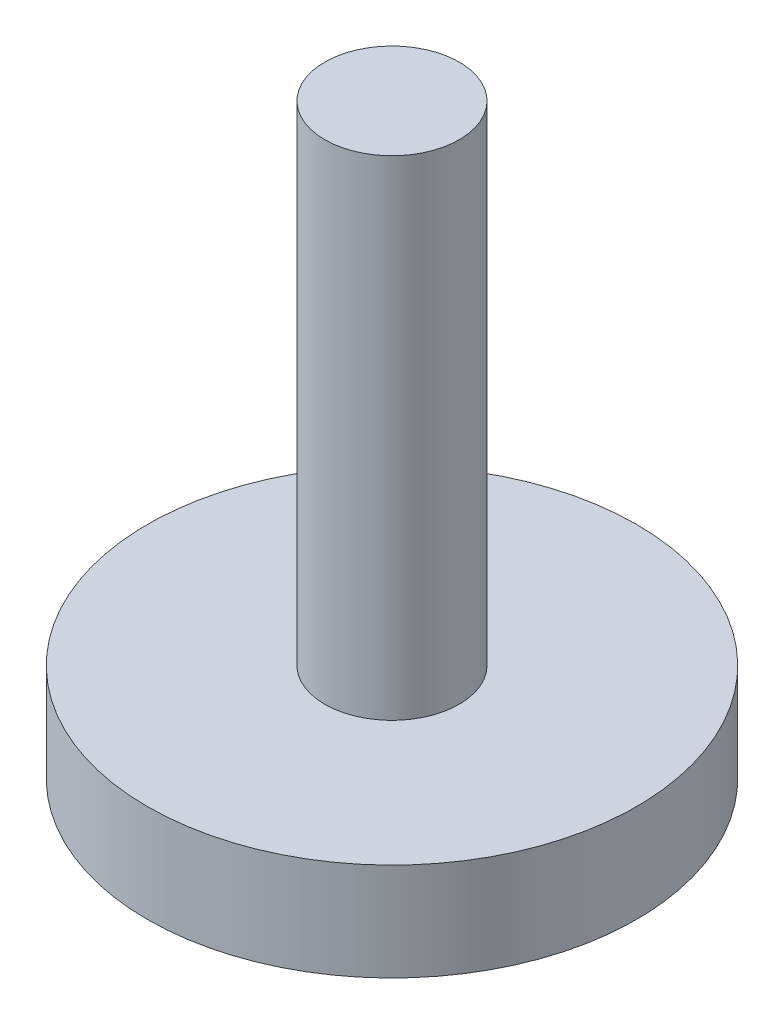
ISO-10303-21;
HEADER;
FILE_DESCRIPTION(('STEP AP214'),'2;1');
FILE_NAME('part.step','',(''),(''),'','','');
FILE_SCHEMA(('AUTOMOTIVE_DESIGN { 1 0 10303 214 1 1 1 1 }'));
ENDSEC;
DATA;
#1=APPLICATION_CONTEXT('core data for automotive mechanical design processes');
#2=APPLICATION_PROTOCOL_DEFINITION('international standard','automotive_design',2000,#1);
#3=PRODUCT_CONTEXT('',#1,'mechanical');
#4=PRODUCT('Part','Part','',(#3));
#5=PRODUCT_RELATED_PRODUCT_CATEGORY('part','',(#4));
#6=PRODUCT_DEFINITION_FORMATION('','',#4);
#7=PRODUCT_DEFINITION_CONTEXT('part definition',#1,'design');
#8=PRODUCT_DEFINITION('design','',#6,#7);
#9=PRODUCT_DEFINITION_SHAPE('','',#8);
#10=(LENGTH_UNIT() NAMED_UNIT(*) SI_UNIT(.MILLI.,.METRE.));
#11=(NAMED_UNIT(*) PLANE_ANGLE_UNIT() SI_UNIT($,.RADIAN.));
#12=(NAMED_UNIT(*) SI_UNIT($,.STERADIAN.) SOLID_ANGLE_UNIT());
#13=UNCERTAINTY_MEASURE_WITH_UNIT(LENGTH_MEASURE(1.E-05),#10,'distance_accuracy_value','');
#14=(GEOMETRIC_REPRESENTATION_CONTEXT(3) GLOBAL_UNCERTAINTY_ASSIGNED_CONTEXT((#13)) GLOBAL_UNIT_ASSIGNED_CONTEXT((#10,
#11,#12)) REPRESENTATION_CONTEXT('',''));
#15=CARTESIAN_POINT('',(0.,0.,0.));
#16=DIRECTION('',(0.,0.,1.));
#17=DIRECTION('',(1.,0.,0.));
#18=AXIS2_PLACEMENT_3D('',#15,#16,#17);
#19=CARTESIAN_POINT('',(0.,3.,0.));
#20=DIRECTION('',(0.,-1.,0.));
#21=DIRECTION('',(0.,0.,-1.));
#22=AXIS2_PLACEMENT_3D('',#19,#20,#21);
#23=CYLINDRICAL_SURFACE('',#22,7.5);
#24=CARTESIAN_POINT('',(0.,3.,0.));
#25=DIRECTION('',(0.,1.,0.));
#26=DIRECTION('',(0.,0.,1.));
#27=AXIS2_PLACEMENT_3D('',#24,#25,#26);
#28=CIRCLE('',#27,7.5);
#29=CARTESIAN_POINT('',(0.,3.,7.5));
#30=VERTEX_POINT('',#29);
#31=EDGE_CURVE('E45',#30,#30,#28,.T.);
#32=ORIENTED_EDGE('',*,*,#31,.F.);
#33=EDGE_LOOP('',(#32));
#34=FACE_BOUND('',#33,.T.);
#35=CARTESIAN_POINT('',(0.,0.,0.));
#36=DIRECTION('',(0.,1.,0.));
#37=DIRECTION('',(0.,0.,1.));
#38=AXIS2_PLACEMENT_3D('',#35,#36,#37);
#39=CIRCLE('',#38,7.5);
#40=CARTESIAN_POINT('',(0.,0.,7.5));
#41=VERTEX_POINT('',#40);
#42=EDGE_CURVE('E40',#41,#41,#39,.T.);
#43=ORIENTED_EDGE('',*,*,#42,.T.);
#44=EDGE_LOOP('',(#43));
#45=FACE_BOUND('',#44,.T.);
#46=ADVANCED_FACE('F37',(#34,#45),#23,.T.);
#47=CARTESIAN_POINT('',(0.,3.,0.));
#48=DIRECTION('',(0.,1.,0.));
#49=DIRECTION('',(0.,0.,1.));
#50=AXIS2_PLACEMENT_3D('',#47,#48,#49);
#51=PLANE('',#50);
#52=CARTESIAN_POINT('',(0.,3.,0.));
#53=DIRECTION('',(0.,1.,0.));
#54=DIRECTION('',(0.,0.,1.));
#55=AXIS2_PLACEMENT_3D('',#52,#53,#54);
#56=CIRCLE('',#55,2.0625);
#57=CARTESIAN_POINT('',(0.,3.,2.0625));
#58=VERTEX_POINT('',#57);
#59=EDGE_CURVE('E10',#58,#58,#56,.T.);
#60=ORIENTED_EDGE('',*,*,#59,.F.);
#61=EDGE_LOOP('',(#60));
#62=FACE_BOUND('',#61,.T.);
#63=ORIENTED_EDGE('',*,*,#31,.T.);
#64=EDGE_LOOP('',(#63));
#65=FACE_BOUND('',#64,.T.);
#66=ADVANCED_FACE('F65',(#62,#65),#51,.T.);
#67=CARTESIAN_POINT('',(0.,0.,0.));
#68=DIRECTION('',(0.,1.,0.));
#69=DIRECTION('',(0.,0.,1.));
#70=AXIS2_PLACEMENT_3D('',#67,#68,#69);
#71=PLANE('',#70);
#72=ORIENTED_EDGE('',*,*,#42,.F.);
#73=EDGE_LOOP('',(#72));
#74=FACE_BOUND('',#73,.T.);
#75=ADVANCED_FACE('F62',(#74),#71,.F.);
#76=CARTESIAN_POINT('',(0.,18.,0.));
#77=DIRECTION('',(0.,-1.,0.));
#78=DIRECTION('',(0.,0.,-1.));
#79=AXIS2_PLACEMENT_3D('',#76,#77,#78);
#80=CYLINDRICAL_SURFACE('',#79,2.0625);
#81=CARTESIAN_POINT('',(0.,18.,0.));
#82=DIRECTION('',(0.,1.,0.));
#83=DIRECTION('',(0.,0.,1.));
#84=AXIS2_PLACEMENT_3D('',#81,#82,#83);
#85=CIRCLE('',#84,2.0625);
#86=CARTESIAN_POINT('',(0.,18.,2.0625));
#87=VERTEX_POINT('',#86);
#88=EDGE_CURVE('E52',#87,#87,#85,.T.);
#89=ORIENTED_EDGE('',*,*,#88,.F.);
#90=EDGE_LOOP('',(#89));
#91=FACE_BOUND('',#90,.T.);
#92=ORIENTED_EDGE('',*,*,#59,.T.);
#93=EDGE_LOOP('',(#92));
#94=FACE_BOUND('',#93,.T.);
#95=ADVANCED_FACE('F64',(#91,#94),#80,.T.);
#96=CARTESIAN_POINT('',(0.,18.,0.));
#97=DIRECTION('',(0.,1.,0.));
#98=DIRECTION('',(0.,0.,1.));
#99=AXIS2_PLACEMENT_3D('',#96,#97,#98);
#100=PLANE('',#99);
#101=ORIENTED_EDGE('',*,*,#88,.T.);
#102=EDGE_LOOP('',(#101));
#103=FACE_BOUND('',#102,.T.);
#104=ADVANCED_FACE('F70',(#103),#100,.T.);
#105=CLOSED_SHELL('',(#46,#66,#75,#95,#104));
#106=MANIFOLD_SOLID_BREP('B2',#105);
#107=ADVANCED_BREP_SHAPE_REPRESENTATION('',(#18,#106),#14);
#108=SHAPE_DEFINITION_REPRESENTATION(#9,#107);
ENDSEC;
END-ISO-10303-21;
